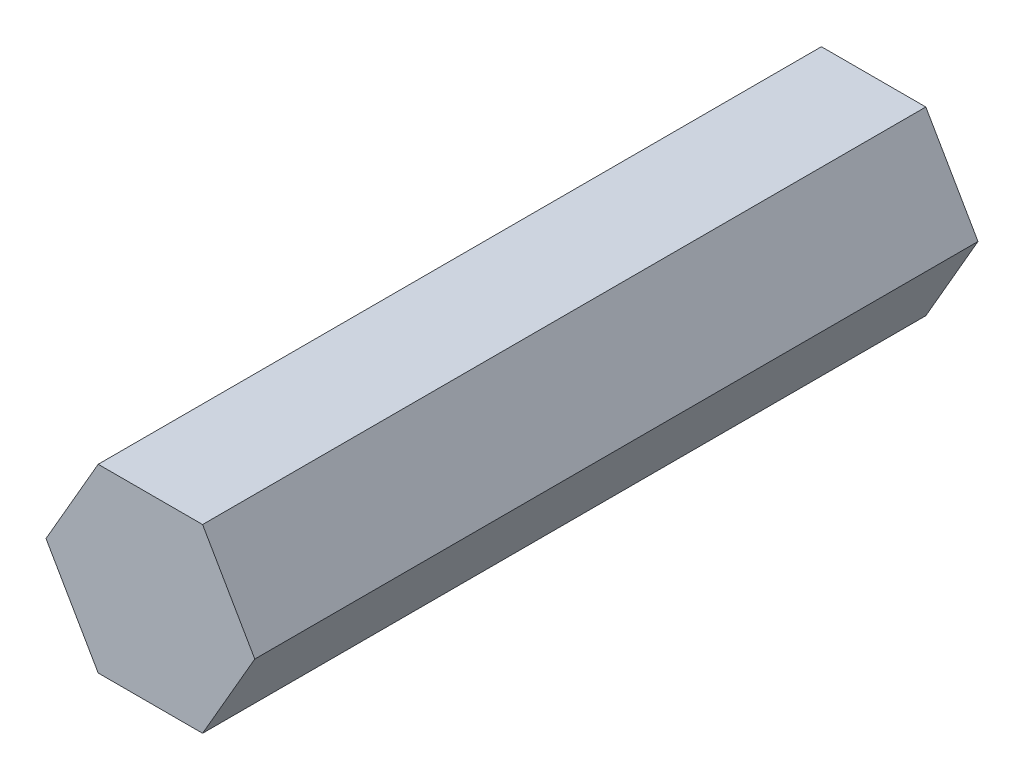
ISO-10303-21;
HEADER;
FILE_DESCRIPTION(('STEP AP214'),'2;1');
FILE_NAME('part.step','',(''),(''),'','','');
FILE_SCHEMA(('AUTOMOTIVE_DESIGN { 1 0 10303 214 1 1 1 1 }'));
ENDSEC;
DATA;
#1=APPLICATION_CONTEXT('core data for automotive mechanical design processes');
#2=APPLICATION_PROTOCOL_DEFINITION('international standard','automotive_design',2000,#1);
#3=PRODUCT_CONTEXT('',#1,'mechanical');
#4=PRODUCT('Part','Part','',(#3));
#5=PRODUCT_RELATED_PRODUCT_CATEGORY('part','',(#4));
#6=PRODUCT_DEFINITION_FORMATION('','',#4);
#7=PRODUCT_DEFINITION_CONTEXT('part definition',#1,'design');
#8=PRODUCT_DEFINITION('design','',#6,#7);
#9=PRODUCT_DEFINITION_SHAPE('','',#8);
#10=(LENGTH_UNIT() NAMED_UNIT(*) SI_UNIT(.MILLI.,.METRE.));
#11=(NAMED_UNIT(*) PLANE_ANGLE_UNIT() SI_UNIT($,.RADIAN.));
#12=(NAMED_UNIT(*) SI_UNIT($,.STERADIAN.) SOLID_ANGLE_UNIT());
#13=UNCERTAINTY_MEASURE_WITH_UNIT(LENGTH_MEASURE(1.E-05),#10,'distance_accuracy_value','');
#14=(GEOMETRIC_REPRESENTATION_CONTEXT(3) GLOBAL_UNCERTAINTY_ASSIGNED_CONTEXT((#13)) GLOBAL_UNIT_ASSIGNED_CONTEXT((#10,
#11,#12)) REPRESENTATION_CONTEXT('',''));
#15=CARTESIAN_POINT('',(0.,0.,0.));
#16=DIRECTION('',(0.,0.,1.));
#17=DIRECTION('',(1.,0.,0.));
#18=AXIS2_PLACEMENT_3D('',#15,#16,#17);
#19=CARTESIAN_POINT('',(3.66617420935413,-6.35,50.8));
#20=DIRECTION('',(-0.866025403784439,0.5,0.));
#21=DIRECTION('',(-0.5,-0.866025403784439,0.));
#22=AXIS2_PLACEMENT_3D('',#19,#20,#21);
#23=PLANE('',#22);
#24=DIRECTION('',(0.5,0.866025403784439,0.));
#25=VECTOR('',#24,1.);
#26=CARTESIAN_POINT('',(3.66617420935413,-6.35,0.));
#27=LINE('',#26,#25);
#28=CARTESIAN_POINT('',(3.66617420935413,-6.35,0.));
#29=VERTEX_POINT('',#28);
#30=CARTESIAN_POINT('',(7.33234841870825,0.,0.));
#31=VERTEX_POINT('',#30);
#32=EDGE_CURVE('E125',#29,#31,#27,.T.);
#33=ORIENTED_EDGE('',*,*,#32,.T.);
#34=DIRECTION('',(0.,0.,-1.));
#35=VECTOR('',#34,1.);
#36=CARTESIAN_POINT('',(7.33234841870825,0.,50.8));
#37=LINE('',#36,#35);
#38=CARTESIAN_POINT('',(7.33234841870825,0.,50.8));
#39=VERTEX_POINT('',#38);
#40=EDGE_CURVE('E11',#39,#31,#37,.T.);
#41=ORIENTED_EDGE('',*,*,#40,.F.);
#42=DIRECTION('',(0.5,0.866025403784439,0.));
#43=VECTOR('',#42,1.);
#44=CARTESIAN_POINT('',(3.66617420935413,-6.35,50.8));
#45=LINE('',#44,#43);
#46=CARTESIAN_POINT('',(3.66617420935413,-6.35,50.8));
#47=VERTEX_POINT('',#46);
#48=EDGE_CURVE('E135',#47,#39,#45,.T.);
#49=ORIENTED_EDGE('',*,*,#48,.F.);
#50=DIRECTION('',(0.,0.,-1.));
#51=VECTOR('',#50,1.);
#52=CARTESIAN_POINT('',(3.66617420935413,-6.35,50.8));
#53=LINE('',#52,#51);
#54=EDGE_CURVE('E121',#47,#29,#53,.T.);
#55=ORIENTED_EDGE('',*,*,#54,.T.);
#56=EDGE_LOOP('',(#33,#41,#49,#55));
#57=FACE_BOUND('',#56,.T.);
#58=ADVANCED_FACE('F41',(#57),#23,.F.);
#59=CARTESIAN_POINT('',(7.33234841870825,0.,50.8));
#60=DIRECTION('',(-0.866025403784438,-0.5,0.));
#61=DIRECTION('',(0.5,-0.866025403784438,0.));
#62=AXIS2_PLACEMENT_3D('',#59,#60,#61);
#63=PLANE('',#62);
#64=DIRECTION('',(-0.5,0.866025403784438,0.));
#65=VECTOR('',#64,1.);
#66=CARTESIAN_POINT('',(7.33234841870825,0.,0.));
#67=LINE('',#66,#65);
#68=CARTESIAN_POINT('',(3.66617420935412,6.35,0.));
#69=VERTEX_POINT('',#68);
#70=EDGE_CURVE('E128',#31,#69,#67,.T.);
#71=ORIENTED_EDGE('',*,*,#70,.T.);
#72=DIRECTION('',(0.,0.,-1.));
#73=VECTOR('',#72,1.);
#74=CARTESIAN_POINT('',(3.66617420935412,6.35,50.8));
#75=LINE('',#74,#73);
#76=CARTESIAN_POINT('',(3.66617420935412,6.35,50.8));
#77=VERTEX_POINT('',#76);
#78=EDGE_CURVE('E49',#77,#69,#75,.T.);
#79=ORIENTED_EDGE('',*,*,#78,.F.);
#80=DIRECTION('',(-0.5,0.866025403784438,0.));
#81=VECTOR('',#80,1.);
#82=CARTESIAN_POINT('',(7.33234841870825,0.,50.8));
#83=LINE('',#82,#81);
#84=EDGE_CURVE('E94',#39,#77,#83,.T.);
#85=ORIENTED_EDGE('',*,*,#84,.F.);
#86=ORIENTED_EDGE('',*,*,#40,.T.);
#87=EDGE_LOOP('',(#71,#79,#85,#86));
#88=FACE_BOUND('',#87,.T.);
#89=ADVANCED_FACE('F159',(#88),#63,.F.);
#90=CARTESIAN_POINT('',(3.66617420935412,6.35,50.8));
#91=DIRECTION('',(0.,-1.,0.));
#92=DIRECTION('',(0.,0.,-1.));
#93=AXIS2_PLACEMENT_3D('',#90,#91,#92);
#94=PLANE('',#93);
#95=DIRECTION('',(-1.,0.,0.));
#96=VECTOR('',#95,1.);
#97=CARTESIAN_POINT('',(3.66617420935412,6.35,0.));
#98=LINE('',#97,#96);
#99=CARTESIAN_POINT('',(-3.66617420935412,6.35,0.));
#100=VERTEX_POINT('',#99);
#101=EDGE_CURVE('E130',#69,#100,#98,.T.);
#102=ORIENTED_EDGE('',*,*,#101,.T.);
#103=DIRECTION('',(0.,0.,-1.));
#104=VECTOR('',#103,1.);
#105=CARTESIAN_POINT('',(-3.66617420935412,6.35,50.8));
#106=LINE('',#105,#104);
#107=CARTESIAN_POINT('',(-3.66617420935412,6.35,50.8));
#108=VERTEX_POINT('',#107);
#109=EDGE_CURVE('E116',#108,#100,#106,.T.);
#110=ORIENTED_EDGE('',*,*,#109,.F.);
#111=DIRECTION('',(-1.,0.,0.));
#112=VECTOR('',#111,1.);
#113=CARTESIAN_POINT('',(3.66617420935412,6.35,50.8));
#114=LINE('',#113,#112);
#115=EDGE_CURVE('E107',#77,#108,#114,.T.);
#116=ORIENTED_EDGE('',*,*,#115,.F.);
#117=ORIENTED_EDGE('',*,*,#78,.T.);
#118=EDGE_LOOP('',(#102,#110,#116,#117));
#119=FACE_BOUND('',#118,.T.);
#120=ADVANCED_FACE('F141',(#119),#94,.F.);
#121=CARTESIAN_POINT('',(-3.66617420935412,6.35,50.8));
#122=DIRECTION('',(0.866025403784438,-0.5,0.));
#123=DIRECTION('',(0.5,0.866025403784439,0.));
#124=AXIS2_PLACEMENT_3D('',#121,#122,#123);
#125=PLANE('',#124);
#126=DIRECTION('',(-0.5,-0.866025403784438,0.));
#127=VECTOR('',#126,1.);
#128=CARTESIAN_POINT('',(-3.66617420935412,6.35,0.));
#129=LINE('',#128,#127);
#130=CARTESIAN_POINT('',(-7.33234841870825,0.,0.));
#131=VERTEX_POINT('',#130);
#132=EDGE_CURVE('E115',#100,#131,#129,.T.);
#133=ORIENTED_EDGE('',*,*,#132,.T.);
#134=DIRECTION('',(0.,0.,-1.));
#135=VECTOR('',#134,1.);
#136=CARTESIAN_POINT('',(-7.33234841870825,0.,50.8));
#137=LINE('',#136,#135);
#138=CARTESIAN_POINT('',(-7.33234841870825,0.,50.8));
#139=VERTEX_POINT('',#138);
#140=EDGE_CURVE('E112',#139,#131,#137,.T.);
#141=ORIENTED_EDGE('',*,*,#140,.F.);
#142=DIRECTION('',(-0.5,-0.866025403784438,0.));
#143=VECTOR('',#142,1.);
#144=CARTESIAN_POINT('',(-3.66617420935412,6.35,50.8));
#145=LINE('',#144,#143);
#146=EDGE_CURVE('E101',#108,#139,#145,.T.);
#147=ORIENTED_EDGE('',*,*,#146,.F.);
#148=ORIENTED_EDGE('',*,*,#109,.T.);
#149=EDGE_LOOP('',(#133,#141,#147,#148));
#150=FACE_BOUND('',#149,.T.);
#151=ADVANCED_FACE('F113',(#150),#125,.F.);
#152=CARTESIAN_POINT('',(-7.33234841870825,0.,50.8));
#153=DIRECTION('',(0.866025403784438,0.5,0.));
#154=DIRECTION('',(-0.5,0.866025403784438,0.));
#155=AXIS2_PLACEMENT_3D('',#152,#153,#154);
#156=PLANE('',#155);
#157=DIRECTION('',(0.5,-0.866025403784438,0.));
#158=VECTOR('',#157,1.);
#159=CARTESIAN_POINT('',(-7.33234841870825,0.,0.));
#160=LINE('',#159,#158);
#161=CARTESIAN_POINT('',(-3.66617420935412,-6.35,0.));
#162=VERTEX_POINT('',#161);
#163=EDGE_CURVE('E80',#131,#162,#160,.T.);
#164=ORIENTED_EDGE('',*,*,#163,.T.);
#165=DIRECTION('',(0.,0.,-1.));
#166=VECTOR('',#165,1.);
#167=CARTESIAN_POINT('',(-3.66617420935412,-6.35,50.8));
#168=LINE('',#167,#166);
#169=CARTESIAN_POINT('',(-3.66617420935412,-6.35,50.8));
#170=VERTEX_POINT('',#169);
#171=EDGE_CURVE('E117',#170,#162,#168,.T.);
#172=ORIENTED_EDGE('',*,*,#171,.F.);
#173=DIRECTION('',(0.5,-0.866025403784438,0.));
#174=VECTOR('',#173,1.);
#175=CARTESIAN_POINT('',(-7.33234841870825,0.,50.8));
#176=LINE('',#175,#174);
#177=EDGE_CURVE('E105',#139,#170,#176,.T.);
#178=ORIENTED_EDGE('',*,*,#177,.F.);
#179=ORIENTED_EDGE('',*,*,#140,.T.);
#180=EDGE_LOOP('',(#164,#172,#178,#179));
#181=FACE_BOUND('',#180,.T.);
#182=ADVANCED_FACE('F119',(#181),#156,.F.);
#183=CARTESIAN_POINT('',(-3.66617420935412,-6.35,50.8));
#184=DIRECTION('',(0.,1.,0.));
#185=DIRECTION('',(-1.,0.,0.));
#186=AXIS2_PLACEMENT_3D('',#183,#184,#185);
#187=PLANE('',#186);
#188=DIRECTION('',(1.,0.,0.));
#189=VECTOR('',#188,1.);
#190=CARTESIAN_POINT('',(-3.66617420935412,-6.35,0.));
#191=LINE('',#190,#189);
#192=EDGE_CURVE('E86',#162,#29,#191,.T.);
#193=ORIENTED_EDGE('',*,*,#192,.T.);
#194=ORIENTED_EDGE('',*,*,#54,.F.);
#195=DIRECTION('',(1.,0.,0.));
#196=VECTOR('',#195,1.);
#197=CARTESIAN_POINT('',(-3.66617420935412,-6.35,50.8));
#198=LINE('',#197,#196);
#199=EDGE_CURVE('E57',#170,#47,#198,.T.);
#200=ORIENTED_EDGE('',*,*,#199,.F.);
#201=ORIENTED_EDGE('',*,*,#171,.T.);
#202=EDGE_LOOP('',(#193,#194,#200,#201));
#203=FACE_BOUND('',#202,.T.);
#204=ADVANCED_FACE('F148',(#203),#187,.F.);
#205=CARTESIAN_POINT('',(0.,0.,50.8));
#206=DIRECTION('',(0.,0.,1.));
#207=DIRECTION('',(1.,0.,0.));
#208=AXIS2_PLACEMENT_3D('',#205,#206,#207);
#209=PLANE('',#208);
#210=ORIENTED_EDGE('',*,*,#48,.T.);
#211=ORIENTED_EDGE('',*,*,#84,.T.);
#212=ORIENTED_EDGE('',*,*,#115,.T.);
#213=ORIENTED_EDGE('',*,*,#146,.T.);
#214=ORIENTED_EDGE('',*,*,#177,.T.);
#215=ORIENTED_EDGE('',*,*,#199,.T.);
#216=EDGE_LOOP('',(#210,#211,#212,#213,#214,#215));
#217=FACE_BOUND('',#216,.T.);
#218=ADVANCED_FACE('F103',(#217),#209,.T.);
#219=CARTESIAN_POINT('',(0.,0.,0.));
#220=DIRECTION('',(0.,0.,1.));
#221=DIRECTION('',(1.,0.,0.));
#222=AXIS2_PLACEMENT_3D('',#219,#220,#221);
#223=PLANE('',#222);
#224=ORIENTED_EDGE('',*,*,#32,.F.);
#225=ORIENTED_EDGE('',*,*,#192,.F.);
#226=ORIENTED_EDGE('',*,*,#163,.F.);
#227=ORIENTED_EDGE('',*,*,#132,.F.);
#228=ORIENTED_EDGE('',*,*,#101,.F.);
#229=ORIENTED_EDGE('',*,*,#70,.F.);
#230=EDGE_LOOP('',(#224,#225,#226,#227,#228,#229));
#231=FACE_BOUND('',#230,.T.);
#232=ADVANCED_FACE('F144',(#231),#223,.F.);
#233=CLOSED_SHELL('',(#58,#89,#120,#151,#182,#204,#218,#232));
#234=MANIFOLD_SOLID_BREP('B2',#233);
#235=ADVANCED_BREP_SHAPE_REPRESENTATION('',(#18,#234),#14);
#236=SHAPE_DEFINITION_REPRESENTATION(#9,#235);
ENDSEC;
END-ISO-10303-21;
